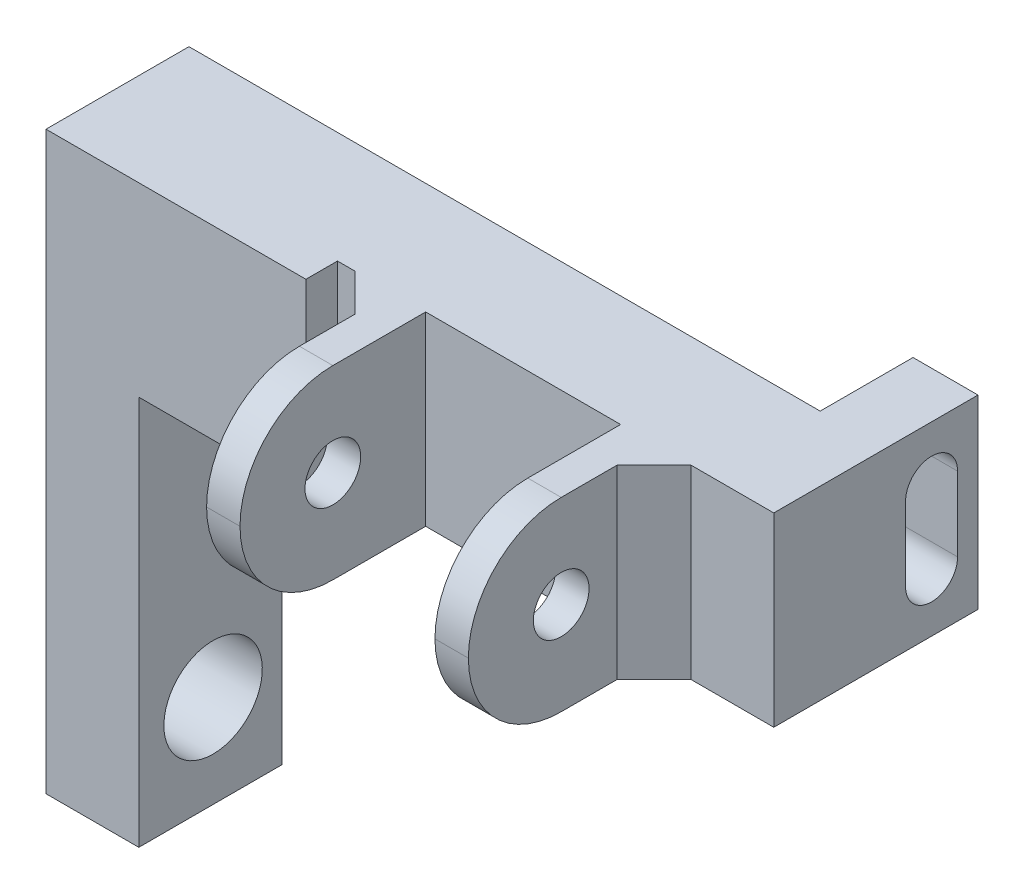
ISO-10303-21;
HEADER;
FILE_DESCRIPTION(('STEP AP214'),'2;1');
FILE_NAME('part.step','',(''),(''),'','','');
FILE_SCHEMA(('AUTOMOTIVE_DESIGN { 1 0 10303 214 1 1 1 1 }'));
ENDSEC;
DATA;
#1=APPLICATION_CONTEXT('core data for automotive mechanical design processes');
#2=APPLICATION_PROTOCOL_DEFINITION('international standard','automotive_design',2000,#1);
#3=PRODUCT_CONTEXT('',#1,'mechanical');
#4=PRODUCT('Part','Part','',(#3));
#5=PRODUCT_RELATED_PRODUCT_CATEGORY('part','',(#4));
#6=PRODUCT_DEFINITION_FORMATION('','',#4);
#7=PRODUCT_DEFINITION_CONTEXT('part definition',#1,'design');
#8=PRODUCT_DEFINITION('design','',#6,#7);
#9=PRODUCT_DEFINITION_SHAPE('','',#8);
#10=(LENGTH_UNIT() NAMED_UNIT(*) SI_UNIT(.MILLI.,.METRE.));
#11=(NAMED_UNIT(*) PLANE_ANGLE_UNIT() SI_UNIT($,.RADIAN.));
#12=(NAMED_UNIT(*) SI_UNIT($,.STERADIAN.) SOLID_ANGLE_UNIT());
#13=UNCERTAINTY_MEASURE_WITH_UNIT(LENGTH_MEASURE(1.E-05),#10,'distance_accuracy_value','');
#14=(GEOMETRIC_REPRESENTATION_CONTEXT(3) GLOBAL_UNCERTAINTY_ASSIGNED_CONTEXT((#13)) GLOBAL_UNIT_ASSIGNED_CONTEXT((#10,
#11,#12)) REPRESENTATION_CONTEXT('',''));
#15=CARTESIAN_POINT('',(0.,0.,0.));
#16=DIRECTION('',(0.,0.,1.));
#17=DIRECTION('',(1.,0.,0.));
#18=AXIS2_PLACEMENT_3D('',#15,#16,#17);
#19=CARTESIAN_POINT('',(0.,0.,6.));
#20=DIRECTION('',(0.,0.,1.));
#21=DIRECTION('',(1.,0.,0.));
#22=AXIS2_PLACEMENT_3D('',#19,#20,#21);
#23=PLANE('',#22);
#24=DIRECTION('',(1.,0.,0.));
#25=VECTOR('',#24,1.);
#26=CARTESIAN_POINT('',(-10.,5.,6.));
#27=LINE('',#26,#25);
#28=CARTESIAN_POINT('',(-5.25,5.,6.));
#29=VERTEX_POINT('',#28);
#30=CARTESIAN_POINT('',(5.25,5.,6.));
#31=VERTEX_POINT('',#30);
#32=EDGE_CURVE('E361',#29,#31,#27,.T.);
#33=ORIENTED_EDGE('',*,*,#32,.T.);
#34=DIRECTION('',(0.,-1.,0.));
#35=VECTOR('',#34,1.);
#36=CARTESIAN_POINT('',(5.25,15.,6.));
#37=LINE('',#36,#35);
#38=CARTESIAN_POINT('',(5.25,15.,6.));
#39=VERTEX_POINT('',#38);
#40=EDGE_CURVE('E340',#39,#31,#37,.T.);
#41=ORIENTED_EDGE('',*,*,#40,.F.);
#42=DIRECTION('',(-1.,0.,0.));
#43=VECTOR('',#42,1.);
#44=CARTESIAN_POINT('',(-10.,15.,6.));
#45=LINE('',#44,#43);
#46=CARTESIAN_POINT('',(-5.25,15.,6.));
#47=VERTEX_POINT('',#46);
#48=EDGE_CURVE('E366',#39,#47,#45,.T.);
#49=ORIENTED_EDGE('',*,*,#48,.T.);
#50=DIRECTION('',(0.,1.,0.));
#51=VECTOR('',#50,1.);
#52=CARTESIAN_POINT('',(-5.25,15.,6.));
#53=LINE('',#52,#51);
#54=EDGE_CURVE('E343',#29,#47,#53,.T.);
#55=ORIENTED_EDGE('',*,*,#54,.F.);
#56=EDGE_LOOP('',(#33,#41,#49,#55));
#57=FACE_BOUND('',#56,.T.);
#58=ADVANCED_FACE('F45',(#57),#23,.T.);
#59=CARTESIAN_POINT('',(13.5,15.,6.));
#60=VERTEX_POINT('',#59);
#61=CARTESIAN_POINT('',(9.05,15.,6.));
#62=VERTEX_POINT('',#61);
#63=EDGE_CURVE('E362',#60,#62,#45,.T.);
#64=ORIENTED_EDGE('',*,*,#63,.T.);
#65=DIRECTION('',(0.,-1.,0.));
#66=VECTOR('',#65,1.);
#67=CARTESIAN_POINT('',(9.05,0.,6.));
#68=LINE('',#67,#66);
#69=CARTESIAN_POINT('',(9.05,5.,6.));
#70=VERTEX_POINT('',#69);
#71=EDGE_CURVE('E404',#62,#70,#68,.T.);
#72=ORIENTED_EDGE('',*,*,#71,.T.);
#73=CARTESIAN_POINT('',(13.5,5.,6.));
#74=VERTEX_POINT('',#73);
#75=EDGE_CURVE('E358',#70,#74,#27,.T.);
#76=ORIENTED_EDGE('',*,*,#75,.T.);
#77=DIRECTION('',(0.,-1.,0.));
#78=VECTOR('',#77,1.);
#79=CARTESIAN_POINT('',(13.5,15.,6.));
#80=LINE('',#79,#78);
#81=EDGE_CURVE('E292',#60,#74,#80,.T.);
#82=ORIENTED_EDGE('',*,*,#81,.F.);
#83=EDGE_LOOP('',(#64,#72,#76,#82));
#84=FACE_BOUND('',#83,.T.);
#85=ADVANCED_FACE('F454',(#84),#23,.T.);
#86=CARTESIAN_POINT('',(-10.,5.,6.));
#87=VERTEX_POINT('',#86);
#88=CARTESIAN_POINT('',(-9.04999999999999,5.,6.));
#89=VERTEX_POINT('',#88);
#90=EDGE_CURVE('E226',#87,#89,#27,.T.);
#91=ORIENTED_EDGE('',*,*,#90,.T.);
#92=DIRECTION('',(0.,1.,0.));
#93=VECTOR('',#92,1.);
#94=CARTESIAN_POINT('',(-9.04999999999999,0.,6.));
#95=LINE('',#94,#93);
#96=CARTESIAN_POINT('',(-9.04999999999999,15.,6.));
#97=VERTEX_POINT('',#96);
#98=EDGE_CURVE('E409',#89,#97,#95,.T.);
#99=ORIENTED_EDGE('',*,*,#98,.T.);
#100=CARTESIAN_POINT('',(-10.,15.,6.));
#101=VERTEX_POINT('',#100);
#102=EDGE_CURVE('E360',#97,#101,#45,.T.);
#103=ORIENTED_EDGE('',*,*,#102,.T.);
#104=DIRECTION('',(0.,-1.,0.));
#105=VECTOR('',#104,1.);
#106=CARTESIAN_POINT('',(-10.,15.,6.));
#107=LINE('',#106,#105);
#108=EDGE_CURVE('E356',#101,#87,#107,.T.);
#109=ORIENTED_EDGE('',*,*,#108,.T.);
#110=EDGE_LOOP('',(#91,#99,#103,#109));
#111=FACE_BOUND('',#110,.T.);
#112=ADVANCED_FACE('F420',(#111),#23,.T.);
#113=CARTESIAN_POINT('',(0.,0.,0.));
#114=DIRECTION('',(0.,0.,1.));
#115=DIRECTION('',(1.,0.,0.));
#116=AXIS2_PLACEMENT_3D('',#113,#114,#115);
#117=PLANE('',#116);
#118=DIRECTION('',(-1.,0.,0.));
#119=VECTOR('',#118,1.);
#120=CARTESIAN_POINT('',(0.,5.,0.));
#121=LINE('',#120,#119);
#122=CARTESIAN_POINT('',(10.,5.,0.));
#123=VERTEX_POINT('',#122);
#124=CARTESIAN_POINT('',(-19.,5.,0.));
#125=VERTEX_POINT('',#124);
#126=EDGE_CURVE('E314',#123,#125,#121,.T.);
#127=ORIENTED_EDGE('',*,*,#126,.T.);
#128=DIRECTION('',(0.,-1.,0.));
#129=VECTOR('',#128,1.);
#130=CARTESIAN_POINT('',(-19.,0.,0.));
#131=LINE('',#130,#129);
#132=CARTESIAN_POINT('',(-19.,-16.,0.));
#133=VERTEX_POINT('',#132);
#134=EDGE_CURVE('E248',#125,#133,#131,.T.);
#135=ORIENTED_EDGE('',*,*,#134,.T.);
#136=DIRECTION('',(1.,0.,0.));
#137=VECTOR('',#136,1.);
#138=CARTESIAN_POINT('',(-24.,-16.,0.));
#139=LINE('',#138,#137);
#140=CARTESIAN_POINT('',(-24.,-16.,0.));
#141=VERTEX_POINT('',#140);
#142=EDGE_CURVE('E256',#141,#133,#139,.T.);
#143=ORIENTED_EDGE('',*,*,#142,.F.);
#144=DIRECTION('',(0.,-1.,0.));
#145=VECTOR('',#144,1.);
#146=CARTESIAN_POINT('',(-24.,15.,0.));
#147=LINE('',#146,#145);
#148=CARTESIAN_POINT('',(-24.,15.,0.));
#149=VERTEX_POINT('',#148);
#150=EDGE_CURVE('E593',#149,#141,#147,.T.);
#151=ORIENTED_EDGE('',*,*,#150,.F.);
#152=DIRECTION('',(-1.,0.,0.));
#153=VECTOR('',#152,1.);
#154=CARTESIAN_POINT('',(10.,15.,0.));
#155=LINE('',#154,#153);
#156=CARTESIAN_POINT('',(10.,15.,0.));
#157=VERTEX_POINT('',#156);
#158=EDGE_CURVE('E369',#157,#149,#155,.T.);
#159=ORIENTED_EDGE('',*,*,#158,.F.);
#160=DIRECTION('',(0.,1.,0.));
#161=VECTOR('',#160,1.);
#162=CARTESIAN_POINT('',(10.,-15.,0.));
#163=LINE('',#162,#161);
#164=EDGE_CURVE('E365',#123,#157,#163,.T.);
#165=ORIENTED_EDGE('',*,*,#164,.F.);
#166=EDGE_LOOP('',(#127,#135,#143,#151,#159,#165));
#167=FACE_BOUND('',#166,.T.);
#168=ADVANCED_FACE('F502',(#167),#117,.F.);
#169=CARTESIAN_POINT('',(10.,15.,3.));
#170=DIRECTION('',(0.,-1.,0.));
#171=DIRECTION('',(1.,0.,0.));
#172=AXIS2_PLACEMENT_3D('',#169,#170,#171);
#173=PLANE('',#172);
#174=DIRECTION('',(0.,0.,-1.));
#175=VECTOR('',#174,1.);
#176=CARTESIAN_POINT('',(5.25,15.,16.));
#177=LINE('',#176,#175);
#178=CARTESIAN_POINT('',(5.25,15.,11.));
#179=VERTEX_POINT('',#178);
#180=EDGE_CURVE('E338',#179,#39,#177,.T.);
#181=ORIENTED_EDGE('',*,*,#180,.F.);
#182=DIRECTION('',(-1.,0.,0.));
#183=VECTOR('',#182,1.);
#184=CARTESIAN_POINT('',(7.05,15.,11.));
#185=LINE('',#184,#183);
#186=CARTESIAN_POINT('',(7.05,15.,11.));
#187=VERTEX_POINT('',#186);
#188=EDGE_CURVE('E395',#179,#187,#185,.F.);
#189=ORIENTED_EDGE('',*,*,#188,.T.);
#190=DIRECTION('',(0.,0.,-1.));
#191=VECTOR('',#190,1.);
#192=CARTESIAN_POINT('',(7.05,15.,16.));
#193=LINE('',#192,#191);
#194=CARTESIAN_POINT('',(7.05,15.,8.00000000000002));
#195=VERTEX_POINT('',#194);
#196=EDGE_CURVE('E335',#187,#195,#193,.T.);
#197=ORIENTED_EDGE('',*,*,#196,.T.);
#198=DIRECTION('',(0.707106781186544,0.,-0.707106781186551));
#199=VECTOR('',#198,1.);
#200=CARTESIAN_POINT('',(11.025,15.,4.02499999999998));
#201=LINE('',#200,#199);
#202=EDGE_CURVE('E411',#195,#62,#201,.T.);
#203=ORIENTED_EDGE('',*,*,#202,.T.);
#204=ORIENTED_EDGE('',*,*,#63,.F.);
#205=DIRECTION('',(0.,0.,1.));
#206=VECTOR('',#205,1.);
#207=CARTESIAN_POINT('',(13.5,15.,6.));
#208=LINE('',#207,#206);
#209=CARTESIAN_POINT('',(13.5,15.,-5.));
#210=VERTEX_POINT('',#209);
#211=EDGE_CURVE('E300',#210,#60,#208,.T.);
#212=ORIENTED_EDGE('',*,*,#211,.F.);
#213=DIRECTION('',(-1.,0.,0.));
#214=VECTOR('',#213,1.);
#215=CARTESIAN_POINT('',(13.5,15.,-5.));
#216=LINE('',#215,#214);
#217=CARTESIAN_POINT('',(10.,15.,-5.));
#218=VERTEX_POINT('',#217);
#219=EDGE_CURVE('E303',#210,#218,#216,.T.);
#220=ORIENTED_EDGE('',*,*,#219,.T.);
#221=DIRECTION('',(0.,0.,1.));
#222=VECTOR('',#221,1.);
#223=CARTESIAN_POINT('',(10.,15.,6.));
#224=LINE('',#223,#222);
#225=EDGE_CURVE('E296',#218,#157,#224,.T.);
#226=ORIENTED_EDGE('',*,*,#225,.T.);
#227=ORIENTED_EDGE('',*,*,#158,.T.);
#228=DIRECTION('',(0.,0.,-1.));
#229=VECTOR('',#228,1.);
#230=CARTESIAN_POINT('',(-24.,15.,7.7));
#231=LINE('',#230,#229);
#232=CARTESIAN_POINT('',(-24.,15.,7.7));
#233=VERTEX_POINT('',#232);
#234=EDGE_CURVE('E591',#233,#149,#231,.T.);
#235=ORIENTED_EDGE('',*,*,#234,.F.);
#236=DIRECTION('',(1.,0.,0.));
#237=VECTOR('',#236,1.);
#238=CARTESIAN_POINT('',(-24.,15.,7.7));
#239=LINE('',#238,#237);
#240=CARTESIAN_POINT('',(-10.,15.,7.7));
#241=VERTEX_POINT('',#240);
#242=EDGE_CURVE('E259',#233,#241,#239,.T.);
#243=ORIENTED_EDGE('',*,*,#242,.T.);
#244=DIRECTION('',(0.,0.,-1.));
#245=VECTOR('',#244,1.);
#246=CARTESIAN_POINT('',(-10.,15.,7.7));
#247=LINE('',#246,#245);
#248=EDGE_CURVE('E241',#241,#101,#247,.T.);
#249=ORIENTED_EDGE('',*,*,#248,.T.);
#250=ORIENTED_EDGE('',*,*,#102,.F.);
#251=DIRECTION('',(0.707106781186543,0.,0.707106781186552));
#252=VECTOR('',#251,1.);
#253=CARTESIAN_POINT('',(-1.02500000000011,15.,14.025));
#254=LINE('',#253,#252);
#255=CARTESIAN_POINT('',(-7.05,15.,8.00000000000002));
#256=VERTEX_POINT('',#255);
#257=EDGE_CURVE('E11',#97,#256,#254,.T.);
#258=ORIENTED_EDGE('',*,*,#257,.T.);
#259=DIRECTION('',(0.,0.,-1.));
#260=VECTOR('',#259,1.);
#261=CARTESIAN_POINT('',(-7.05,15.,16.));
#262=LINE('',#261,#260);
#263=CARTESIAN_POINT('',(-7.05,15.,11.));
#264=VERTEX_POINT('',#263);
#265=EDGE_CURVE('E346',#264,#256,#262,.T.);
#266=ORIENTED_EDGE('',*,*,#265,.F.);
#267=DIRECTION('',(-1.,0.,0.));
#268=VECTOR('',#267,1.);
#269=CARTESIAN_POINT('',(-5.25,15.,11.));
#270=LINE('',#269,#268);
#271=CARTESIAN_POINT('',(-5.25,15.,11.));
#272=VERTEX_POINT('',#271);
#273=EDGE_CURVE('E393',#264,#272,#270,.F.);
#274=ORIENTED_EDGE('',*,*,#273,.T.);
#275=DIRECTION('',(0.,0.,-1.));
#276=VECTOR('',#275,1.);
#277=CARTESIAN_POINT('',(-5.25,15.,16.));
#278=LINE('',#277,#276);
#279=EDGE_CURVE('E349',#272,#47,#278,.T.);
#280=ORIENTED_EDGE('',*,*,#279,.T.);
#281=ORIENTED_EDGE('',*,*,#48,.F.);
#282=EDGE_LOOP('',(#181,#189,#197,#203,#204,#212,#220,#226,#227,#235,#243,#249,#250,#258,#266,
#274,#280,#281));
#283=FACE_BOUND('',#282,.T.);
#284=ADVANCED_FACE('F427',(#283),#173,.F.);
#285=CARTESIAN_POINT('',(-10.,5.,6.));
#286=DIRECTION('',(0.,1.,0.));
#287=DIRECTION('',(-1.,0.,0.));
#288=AXIS2_PLACEMENT_3D('',#285,#286,#287);
#289=PLANE('',#288);
#290=DIRECTION('',(0.,0.,-1.));
#291=VECTOR('',#290,1.);
#292=CARTESIAN_POINT('',(7.05,5.,16.));
#293=LINE('',#292,#291);
#294=CARTESIAN_POINT('',(7.05,5.,11.));
#295=VERTEX_POINT('',#294);
#296=CARTESIAN_POINT('',(7.05,5.,8.00000000000002));
#297=VERTEX_POINT('',#296);
#298=EDGE_CURVE('E331',#295,#297,#293,.T.);
#299=ORIENTED_EDGE('',*,*,#298,.F.);
#300=DIRECTION('',(1.,0.,0.));
#301=VECTOR('',#300,1.);
#302=CARTESIAN_POINT('',(5.25,5.,11.));
#303=LINE('',#302,#301);
#304=CARTESIAN_POINT('',(5.25,5.,11.));
#305=VERTEX_POINT('',#304);
#306=EDGE_CURVE('E378',#295,#305,#303,.F.);
#307=ORIENTED_EDGE('',*,*,#306,.T.);
#308=DIRECTION('',(0.,0.,-1.));
#309=VECTOR('',#308,1.);
#310=CARTESIAN_POINT('',(5.25,5.,16.));
#311=LINE('',#310,#309);
#312=EDGE_CURVE('E329',#305,#31,#311,.T.);
#313=ORIENTED_EDGE('',*,*,#312,.T.);
#314=ORIENTED_EDGE('',*,*,#32,.F.);
#315=DIRECTION('',(0.,0.,-1.));
#316=VECTOR('',#315,1.);
#317=CARTESIAN_POINT('',(-5.25,5.,16.));
#318=LINE('',#317,#316);
#319=CARTESIAN_POINT('',(-5.25,5.,11.));
#320=VERTEX_POINT('',#319);
#321=EDGE_CURVE('E351',#320,#29,#318,.T.);
#322=ORIENTED_EDGE('',*,*,#321,.F.);
#323=DIRECTION('',(1.,0.,0.));
#324=VECTOR('',#323,1.);
#325=CARTESIAN_POINT('',(-7.05,5.,11.));
#326=LINE('',#325,#324);
#327=CARTESIAN_POINT('',(-7.05,5.,11.));
#328=VERTEX_POINT('',#327);
#329=EDGE_CURVE('E375',#320,#328,#326,.F.);
#330=ORIENTED_EDGE('',*,*,#329,.T.);
#331=DIRECTION('',(0.,0.,-1.));
#332=VECTOR('',#331,1.);
#333=CARTESIAN_POINT('',(-7.05,5.,16.));
#334=LINE('',#333,#332);
#335=CARTESIAN_POINT('',(-7.05,5.,8.00000000000002));
#336=VERTEX_POINT('',#335);
#337=EDGE_CURVE('E353',#328,#336,#334,.T.);
#338=ORIENTED_EDGE('',*,*,#337,.T.);
#339=DIRECTION('',(-0.707106781186543,0.,-0.707106781186552));
#340=VECTOR('',#339,1.);
#341=CARTESIAN_POINT('',(-9.52499999999999,5.,5.525));
#342=LINE('',#341,#340);
#343=EDGE_CURVE('E55',#336,#89,#342,.T.);
#344=ORIENTED_EDGE('',*,*,#343,.T.);
#345=ORIENTED_EDGE('',*,*,#90,.F.);
#346=DIRECTION('',(0.,0.,1.));
#347=VECTOR('',#346,1.);
#348=CARTESIAN_POINT('',(-10.,5.,-2.3));
#349=LINE('',#348,#347);
#350=CARTESIAN_POINT('',(-10.,5.,7.7));
#351=VERTEX_POINT('',#350);
#352=EDGE_CURVE('E219',#87,#351,#349,.T.);
#353=ORIENTED_EDGE('',*,*,#352,.T.);
#354=DIRECTION('',(-1.,0.,0.));
#355=VECTOR('',#354,1.);
#356=CARTESIAN_POINT('',(-10.,5.,7.7));
#357=LINE('',#356,#355);
#358=CARTESIAN_POINT('',(-19.,5.,7.7));
#359=VERTEX_POINT('',#358);
#360=EDGE_CURVE('E224',#351,#359,#357,.T.);
#361=ORIENTED_EDGE('',*,*,#360,.T.);
#362=DIRECTION('',(0.,0.,1.));
#363=VECTOR('',#362,1.);
#364=CARTESIAN_POINT('',(-19.,5.,-2.3));
#365=LINE('',#364,#363);
#366=EDGE_CURVE('E230',#125,#359,#365,.T.);
#367=ORIENTED_EDGE('',*,*,#366,.F.);
#368=ORIENTED_EDGE('',*,*,#126,.F.);
#369=DIRECTION('',(0.,0.,-1.));
#370=VECTOR('',#369,1.);
#371=CARTESIAN_POINT('',(10.,5.,6.));
#372=LINE('',#371,#370);
#373=CARTESIAN_POINT('',(10.,5.,-5.));
#374=VERTEX_POINT('',#373);
#375=EDGE_CURVE('E285',#123,#374,#372,.T.);
#376=ORIENTED_EDGE('',*,*,#375,.T.);
#377=DIRECTION('',(-1.,0.,0.));
#378=VECTOR('',#377,1.);
#379=CARTESIAN_POINT('',(13.5,5.,-5.));
#380=LINE('',#379,#378);
#381=CARTESIAN_POINT('',(13.5,5.,-5.));
#382=VERTEX_POINT('',#381);
#383=EDGE_CURVE('E311',#382,#374,#380,.T.);
#384=ORIENTED_EDGE('',*,*,#383,.F.);
#385=DIRECTION('',(0.,0.,-1.));
#386=VECTOR('',#385,1.);
#387=CARTESIAN_POINT('',(13.5,5.,6.));
#388=LINE('',#387,#386);
#389=EDGE_CURVE('E295',#74,#382,#388,.T.);
#390=ORIENTED_EDGE('',*,*,#389,.F.);
#391=ORIENTED_EDGE('',*,*,#75,.F.);
#392=DIRECTION('',(-0.707106781186544,0.,0.707106781186551));
#393=VECTOR('',#392,1.);
#394=CARTESIAN_POINT('',(-0.474999999999899,5.,15.525));
#395=LINE('',#394,#393);
#396=EDGE_CURVE('E413',#70,#297,#395,.T.);
#397=ORIENTED_EDGE('',*,*,#396,.T.);
#398=EDGE_LOOP('',(#299,#307,#313,#314,#322,#330,#338,#344,#345,#353,#361,#367,#368,#376,#384,
#390,#391,#397));
#399=FACE_BOUND('',#398,.T.);
#400=ADVANCED_FACE('F222',(#399),#289,.F.);
#401=CARTESIAN_POINT('',(-7.05,15.,16.));
#402=DIRECTION('',(1.,0.,0.));
#403=DIRECTION('',(0.,0.,-1.));
#404=AXIS2_PLACEMENT_3D('',#401,#402,#403);
#405=PLANE('',#404);
#406=CARTESIAN_POINT('',(-7.05,10.,11.));
#407=DIRECTION('',(-1.,0.,0.));
#408=DIRECTION('',(0.,0.,1.));
#409=AXIS2_PLACEMENT_3D('',#406,#407,#408);
#410=CIRCLE('',#409,1.5);
#411=CARTESIAN_POINT('',(-7.05,10.,12.5));
#412=VERTEX_POINT('',#411);
#413=EDGE_CURVE('E316',#412,#412,#410,.T.);
#414=ORIENTED_EDGE('',*,*,#413,.F.);
#415=EDGE_LOOP('',(#414));
#416=FACE_BOUND('',#415,.T.);
#417=ORIENTED_EDGE('',*,*,#265,.T.);
#418=DIRECTION('',(0.,-1.,0.));
#419=VECTOR('',#418,1.);
#420=CARTESIAN_POINT('',(-7.05,15.,8.00000000000002));
#421=LINE('',#420,#419);
#422=EDGE_CURVE('E406',#256,#336,#421,.T.);
#423=ORIENTED_EDGE('',*,*,#422,.T.);
#424=ORIENTED_EDGE('',*,*,#337,.F.);
#425=CARTESIAN_POINT('',(-7.05,10.,11.));
#426=DIRECTION('',(1.,0.,0.));
#427=DIRECTION('',(0.,0.,-1.));
#428=AXIS2_PLACEMENT_3D('',#425,#426,#427);
#429=CIRCLE('',#428,5.);
#430=CARTESIAN_POINT('',(-7.05,10.,16.));
#431=VERTEX_POINT('',#430);
#432=EDGE_CURVE('E391',#328,#431,#429,.F.);
#433=ORIENTED_EDGE('',*,*,#432,.T.);
#434=CARTESIAN_POINT('',(-7.05,10.,11.));
#435=DIRECTION('',(1.,0.,0.));
#436=DIRECTION('',(0.,0.,-1.));
#437=AXIS2_PLACEMENT_3D('',#434,#435,#436);
#438=CIRCLE('',#437,5.);
#439=EDGE_CURVE('E389',#431,#264,#438,.F.);
#440=ORIENTED_EDGE('',*,*,#439,.T.);
#441=EDGE_LOOP('',(#417,#423,#424,#433,#440));
#442=FACE_BOUND('',#441,.T.);
#443=ADVANCED_FACE('F430',(#416,#442),#405,.F.);
#444=CARTESIAN_POINT('',(-5.25,15.,16.));
#445=DIRECTION('',(-1.,0.,0.));
#446=DIRECTION('',(0.,-1.,0.));
#447=AXIS2_PLACEMENT_3D('',#444,#445,#446);
#448=PLANE('',#447);
#449=CARTESIAN_POINT('',(-5.25,10.,11.));
#450=DIRECTION('',(-1.,0.,0.));
#451=DIRECTION('',(0.,-1.,0.));
#452=AXIS2_PLACEMENT_3D('',#449,#450,#451);
#453=CIRCLE('',#452,1.5);
#454=CARTESIAN_POINT('',(-5.25,8.5,11.));
#455=VERTEX_POINT('',#454);
#456=EDGE_CURVE('E325',#455,#455,#453,.T.);
#457=ORIENTED_EDGE('',*,*,#456,.T.);
#458=EDGE_LOOP('',(#457));
#459=FACE_BOUND('',#458,.T.);
#460=CARTESIAN_POINT('',(-5.25,10.,11.));
#461=DIRECTION('',(-1.,0.,0.));
#462=DIRECTION('',(0.,-1.,0.));
#463=AXIS2_PLACEMENT_3D('',#460,#461,#462);
#464=CIRCLE('',#463,5.);
#465=CARTESIAN_POINT('',(-5.25,10.,16.));
#466=VERTEX_POINT('',#465);
#467=EDGE_CURVE('E385',#272,#466,#464,.F.);
#468=ORIENTED_EDGE('',*,*,#467,.T.);
#469=CARTESIAN_POINT('',(-5.25,10.,11.));
#470=DIRECTION('',(-1.,0.,0.));
#471=DIRECTION('',(0.,-1.,0.));
#472=AXIS2_PLACEMENT_3D('',#469,#470,#471);
#473=CIRCLE('',#472,5.);
#474=EDGE_CURVE('E387',#466,#320,#473,.F.);
#475=ORIENTED_EDGE('',*,*,#474,.T.);
#476=ORIENTED_EDGE('',*,*,#321,.T.);
#477=ORIENTED_EDGE('',*,*,#54,.T.);
#478=ORIENTED_EDGE('',*,*,#279,.F.);
#479=EDGE_LOOP('',(#468,#475,#476,#477,#478));
#480=FACE_BOUND('',#479,.T.);
#481=ADVANCED_FACE('F442',(#459,#480),#448,.F.);
#482=CARTESIAN_POINT('',(5.25,15.,16.));
#483=DIRECTION('',(1.,0.,0.));
#484=DIRECTION('',(0.,1.,0.));
#485=AXIS2_PLACEMENT_3D('',#482,#483,#484);
#486=PLANE('',#485);
#487=CARTESIAN_POINT('',(5.25,10.,11.));
#488=DIRECTION('',(1.,0.,0.));
#489=DIRECTION('',(0.,1.,0.));
#490=AXIS2_PLACEMENT_3D('',#487,#488,#489);
#491=CIRCLE('',#490,1.5);
#492=CARTESIAN_POINT('',(5.25,11.5,11.));
#493=VERTEX_POINT('',#492);
#494=EDGE_CURVE('E322',#493,#493,#491,.T.);
#495=ORIENTED_EDGE('',*,*,#494,.T.);
#496=EDGE_LOOP('',(#495));
#497=FACE_BOUND('',#496,.T.);
#498=ORIENTED_EDGE('',*,*,#312,.F.);
#499=CARTESIAN_POINT('',(5.25,10.,11.));
#500=DIRECTION('',(1.,0.,0.));
#501=DIRECTION('',(0.,1.,0.));
#502=AXIS2_PLACEMENT_3D('',#499,#500,#501);
#503=CIRCLE('',#502,5.);
#504=CARTESIAN_POINT('',(5.25,10.,16.));
#505=VERTEX_POINT('',#504);
#506=EDGE_CURVE('E383',#305,#505,#503,.F.);
#507=ORIENTED_EDGE('',*,*,#506,.T.);
#508=CARTESIAN_POINT('',(5.25,10.,11.));
#509=DIRECTION('',(1.,0.,0.));
#510=DIRECTION('',(0.,1.,0.));
#511=AXIS2_PLACEMENT_3D('',#508,#509,#510);
#512=CIRCLE('',#511,5.);
#513=EDGE_CURVE('E381',#505,#179,#512,.F.);
#514=ORIENTED_EDGE('',*,*,#513,.T.);
#515=ORIENTED_EDGE('',*,*,#180,.T.);
#516=ORIENTED_EDGE('',*,*,#40,.T.);
#517=EDGE_LOOP('',(#498,#507,#514,#515,#516));
#518=FACE_BOUND('',#517,.T.);
#519=ADVANCED_FACE('F477',(#497,#518),#486,.F.);
#520=CARTESIAN_POINT('',(7.05,15.,16.));
#521=DIRECTION('',(-1.,0.,0.));
#522=DIRECTION('',(0.,-1.,0.));
#523=AXIS2_PLACEMENT_3D('',#520,#521,#522);
#524=PLANE('',#523);
#525=CARTESIAN_POINT('',(7.05,10.,11.));
#526=DIRECTION('',(-1.,0.,0.));
#527=DIRECTION('',(0.,-1.,0.));
#528=AXIS2_PLACEMENT_3D('',#525,#526,#527);
#529=CIRCLE('',#528,1.5);
#530=CARTESIAN_POINT('',(7.05,8.5,11.));
#531=VERTEX_POINT('',#530);
#532=EDGE_CURVE('E319',#531,#531,#529,.F.);
#533=ORIENTED_EDGE('',*,*,#532,.F.);
#534=EDGE_LOOP('',(#533));
#535=FACE_BOUND('',#534,.T.);
#536=ORIENTED_EDGE('',*,*,#298,.T.);
#537=DIRECTION('',(0.,1.,0.));
#538=VECTOR('',#537,1.);
#539=CARTESIAN_POINT('',(7.05,15.,8.00000000000002));
#540=LINE('',#539,#538);
#541=EDGE_CURVE('E397',#297,#195,#540,.T.);
#542=ORIENTED_EDGE('',*,*,#541,.T.);
#543=ORIENTED_EDGE('',*,*,#196,.F.);
#544=CARTESIAN_POINT('',(7.05,10.,11.));
#545=DIRECTION('',(-1.,0.,0.));
#546=DIRECTION('',(0.,-1.,0.));
#547=AXIS2_PLACEMENT_3D('',#544,#545,#546);
#548=CIRCLE('',#547,5.);
#549=CARTESIAN_POINT('',(7.05,10.,16.));
#550=VERTEX_POINT('',#549);
#551=EDGE_CURVE('E371',#187,#550,#548,.F.);
#552=ORIENTED_EDGE('',*,*,#551,.T.);
#553=CARTESIAN_POINT('',(7.05,10.,11.));
#554=DIRECTION('',(-1.,0.,0.));
#555=DIRECTION('',(0.,-1.,0.));
#556=AXIS2_PLACEMENT_3D('',#553,#554,#555);
#557=CIRCLE('',#556,5.);
#558=EDGE_CURVE('E373',#550,#295,#557,.F.);
#559=ORIENTED_EDGE('',*,*,#558,.T.);
#560=EDGE_LOOP('',(#536,#542,#543,#552,#559));
#561=FACE_BOUND('',#560,.T.);
#562=ADVANCED_FACE('F469',(#535,#561),#524,.F.);
#563=CARTESIAN_POINT('',(0.,10.,11.));
#564=DIRECTION('',(1.,0.,0.));
#565=DIRECTION('',(0.,1.,0.));
#566=AXIS2_PLACEMENT_3D('',#563,#564,#565);
#567=CYLINDRICAL_SURFACE('',#566,5.);
#568=ORIENTED_EDGE('',*,*,#188,.F.);
#569=ORIENTED_EDGE('',*,*,#513,.F.);
#570=DIRECTION('',(-1.,0.,0.));
#571=VECTOR('',#570,1.);
#572=CARTESIAN_POINT('',(5.25,10.,16.));
#573=LINE('',#572,#571);
#574=EDGE_CURVE('E332',#550,#505,#573,.T.);
#575=ORIENTED_EDGE('',*,*,#574,.F.);
#576=ORIENTED_EDGE('',*,*,#551,.F.);
#577=EDGE_LOOP('',(#568,#569,#575,#576));
#578=FACE_BOUND('',#577,.T.);
#579=ADVANCED_FACE('F483',(#578),#567,.T.);
#580=CARTESIAN_POINT('',(0.,10.,11.));
#581=DIRECTION('',(-1.,0.,0.));
#582=DIRECTION('',(0.,-1.,0.));
#583=AXIS2_PLACEMENT_3D('',#580,#581,#582);
#584=CYLINDRICAL_SURFACE('',#583,5.);
#585=ORIENTED_EDGE('',*,*,#506,.F.);
#586=ORIENTED_EDGE('',*,*,#306,.F.);
#587=ORIENTED_EDGE('',*,*,#558,.F.);
#588=ORIENTED_EDGE('',*,*,#574,.T.);
#589=EDGE_LOOP('',(#585,#586,#587,#588));
#590=FACE_BOUND('',#589,.T.);
#591=ADVANCED_FACE('F475',(#590),#584,.T.);
#592=CARTESIAN_POINT('',(0.,10.,11.));
#593=DIRECTION('',(1.,0.,0.));
#594=DIRECTION('',(0.,1.,0.));
#595=AXIS2_PLACEMENT_3D('',#592,#593,#594);
#596=CYLINDRICAL_SURFACE('',#595,5.);
#597=ORIENTED_EDGE('',*,*,#273,.F.);
#598=ORIENTED_EDGE('',*,*,#439,.F.);
#599=DIRECTION('',(-1.,0.,0.));
#600=VECTOR('',#599,1.);
#601=CARTESIAN_POINT('',(-7.05,10.,16.));
#602=LINE('',#601,#600);
#603=EDGE_CURVE('E328',#466,#431,#602,.T.);
#604=ORIENTED_EDGE('',*,*,#603,.F.);
#605=ORIENTED_EDGE('',*,*,#467,.F.);
#606=EDGE_LOOP('',(#597,#598,#604,#605));
#607=FACE_BOUND('',#606,.T.);
#608=ADVANCED_FACE('F434',(#607),#596,.T.);
#609=CARTESIAN_POINT('',(0.,10.,11.));
#610=DIRECTION('',(-1.,0.,0.));
#611=DIRECTION('',(0.,-1.,0.));
#612=AXIS2_PLACEMENT_3D('',#609,#610,#611);
#613=CYLINDRICAL_SURFACE('',#612,5.);
#614=ORIENTED_EDGE('',*,*,#432,.F.);
#615=ORIENTED_EDGE('',*,*,#329,.F.);
#616=ORIENTED_EDGE('',*,*,#474,.F.);
#617=ORIENTED_EDGE('',*,*,#603,.T.);
#618=EDGE_LOOP('',(#614,#615,#616,#617));
#619=FACE_BOUND('',#618,.T.);
#620=ADVANCED_FACE('F438',(#619),#613,.T.);
#621=CARTESIAN_POINT('',(11.2926406871193,10.,11.));
#622=DIRECTION('',(-1.,0.,0.));
#623=DIRECTION('',(0.,0.,1.));
#624=AXIS2_PLACEMENT_3D('',#621,#622,#623);
#625=CYLINDRICAL_SURFACE('',#624,1.5);
#626=ORIENTED_EDGE('',*,*,#532,.T.);
#627=EDGE_LOOP('',(#626));
#628=FACE_BOUND('',#627,.T.);
#629=ORIENTED_EDGE('',*,*,#494,.F.);
#630=EDGE_LOOP('',(#629));
#631=FACE_BOUND('',#630,.T.);
#632=ADVANCED_FACE('F532',(#628,#631),#625,.F.);
#633=ORIENTED_EDGE('',*,*,#413,.T.);
#634=EDGE_LOOP('',(#633));
#635=FACE_BOUND('',#634,.T.);
#636=ORIENTED_EDGE('',*,*,#456,.F.);
#637=EDGE_LOOP('',(#636));
#638=FACE_BOUND('',#637,.T.);
#639=ADVANCED_FACE('F530',(#635,#638),#625,.F.);
#640=CARTESIAN_POINT('',(7.05,15.,8.00000000000002));
#641=DIRECTION('',(-0.707106781186551,0.,-0.707106781186544));
#642=DIRECTION('',(0.,1.,0.));
#643=AXIS2_PLACEMENT_3D('',#640,#641,#642);
#644=PLANE('',#643);
#645=ORIENTED_EDGE('',*,*,#396,.F.);
#646=ORIENTED_EDGE('',*,*,#71,.F.);
#647=ORIENTED_EDGE('',*,*,#202,.F.);
#648=ORIENTED_EDGE('',*,*,#541,.F.);
#649=EDGE_LOOP('',(#645,#646,#647,#648));
#650=FACE_BOUND('',#649,.T.);
#651=ADVANCED_FACE('F465',(#650),#644,.F.);
#652=CARTESIAN_POINT('',(-7.05,15.,8.00000000000002));
#653=DIRECTION('',(0.707106781186552,0.,-0.707106781186543));
#654=DIRECTION('',(0.,-1.,0.));
#655=AXIS2_PLACEMENT_3D('',#652,#653,#654);
#656=PLANE('',#655);
#657=ORIENTED_EDGE('',*,*,#257,.F.);
#658=ORIENTED_EDGE('',*,*,#98,.F.);
#659=ORIENTED_EDGE('',*,*,#343,.F.);
#660=ORIENTED_EDGE('',*,*,#422,.F.);
#661=EDGE_LOOP('',(#657,#658,#659,#660));
#662=FACE_BOUND('',#661,.T.);
#663=ADVANCED_FACE('F48',(#662),#656,.F.);
#664=CARTESIAN_POINT('',(10.,0.,0.));
#665=DIRECTION('',(1.,0.,0.));
#666=DIRECTION('',(0.,0.,-1.));
#667=AXIS2_PLACEMENT_3D('',#664,#665,#666);
#668=PLANE('',#667);
#669=DIRECTION('',(0.,-1.,0.));
#670=VECTOR('',#669,1.);
#671=CARTESIAN_POINT('',(10.,8.,-1.1));
#672=LINE('',#671,#670);
#673=CARTESIAN_POINT('',(10.,12.,-1.1));
#674=VERTEX_POINT('',#673);
#675=CARTESIAN_POINT('',(10.,8.,-1.1));
#676=VERTEX_POINT('',#675);
#677=EDGE_CURVE('E270',#674,#676,#672,.T.);
#678=ORIENTED_EDGE('',*,*,#677,.T.);
#679=CARTESIAN_POINT('',(10.,8.,-2.5));
#680=DIRECTION('',(1.,0.,0.));
#681=DIRECTION('',(0.,0.,-1.));
#682=AXIS2_PLACEMENT_3D('',#679,#680,#681);
#683=CIRCLE('',#682,1.4);
#684=CARTESIAN_POINT('',(10.,8.,-3.9));
#685=VERTEX_POINT('',#684);
#686=EDGE_CURVE('E262',#676,#685,#683,.T.);
#687=ORIENTED_EDGE('',*,*,#686,.T.);
#688=DIRECTION('',(0.,1.,0.));
#689=VECTOR('',#688,1.);
#690=CARTESIAN_POINT('',(10.,8.,-3.9));
#691=LINE('',#690,#689);
#692=CARTESIAN_POINT('',(10.,12.,-3.9));
#693=VERTEX_POINT('',#692);
#694=EDGE_CURVE('E265',#685,#693,#691,.T.);
#695=ORIENTED_EDGE('',*,*,#694,.T.);
#696=CARTESIAN_POINT('',(10.,12.,-2.5));
#697=DIRECTION('',(1.,0.,0.));
#698=DIRECTION('',(0.,0.,-1.));
#699=AXIS2_PLACEMENT_3D('',#696,#697,#698);
#700=CIRCLE('',#699,1.4);
#701=EDGE_CURVE('E70',#693,#674,#700,.T.);
#702=ORIENTED_EDGE('',*,*,#701,.T.);
#703=EDGE_LOOP('',(#678,#687,#695,#702));
#704=FACE_BOUND('',#703,.T.);
#705=ORIENTED_EDGE('',*,*,#375,.F.);
#706=ORIENTED_EDGE('',*,*,#164,.T.);
#707=ORIENTED_EDGE('',*,*,#225,.F.);
#708=DIRECTION('',(0.,1.,0.));
#709=VECTOR('',#708,1.);
#710=CARTESIAN_POINT('',(10.,15.,-5.));
#711=LINE('',#710,#709);
#712=EDGE_CURVE('E305',#374,#218,#711,.T.);
#713=ORIENTED_EDGE('',*,*,#712,.F.);
#714=EDGE_LOOP('',(#705,#706,#707,#713));
#715=FACE_BOUND('',#714,.T.);
#716=ADVANCED_FACE('F537',(#704,#715),#668,.F.);
#717=CARTESIAN_POINT('',(13.5,15.,-5.));
#718=DIRECTION('',(0.,0.,1.));
#719=DIRECTION('',(0.,-1.,0.));
#720=AXIS2_PLACEMENT_3D('',#717,#718,#719);
#721=PLANE('',#720);
#722=ORIENTED_EDGE('',*,*,#712,.T.);
#723=ORIENTED_EDGE('',*,*,#219,.F.);
#724=DIRECTION('',(0.,1.,0.));
#725=VECTOR('',#724,1.);
#726=CARTESIAN_POINT('',(13.5,15.,-5.));
#727=LINE('',#726,#725);
#728=EDGE_CURVE('E298',#382,#210,#727,.T.);
#729=ORIENTED_EDGE('',*,*,#728,.F.);
#730=ORIENTED_EDGE('',*,*,#383,.T.);
#731=EDGE_LOOP('',(#722,#723,#729,#730));
#732=FACE_BOUND('',#731,.T.);
#733=ADVANCED_FACE('F534',(#732),#721,.F.);
#734=CARTESIAN_POINT('',(13.5,0.,0.));
#735=DIRECTION('',(1.,0.,0.));
#736=DIRECTION('',(0.,0.,-1.));
#737=AXIS2_PLACEMENT_3D('',#734,#735,#736);
#738=PLANE('',#737);
#739=CARTESIAN_POINT('',(13.5,8.,-2.5));
#740=DIRECTION('',(1.,0.,0.));
#741=DIRECTION('',(0.,0.,-1.));
#742=AXIS2_PLACEMENT_3D('',#739,#740,#741);
#743=CIRCLE('',#742,1.4);
#744=CARTESIAN_POINT('',(13.5,8.,-1.1));
#745=VERTEX_POINT('',#744);
#746=CARTESIAN_POINT('',(13.5,8.,-3.9));
#747=VERTEX_POINT('',#746);
#748=EDGE_CURVE('E261',#745,#747,#743,.T.);
#749=ORIENTED_EDGE('',*,*,#748,.F.);
#750=DIRECTION('',(0.,-1.,0.));
#751=VECTOR('',#750,1.);
#752=CARTESIAN_POINT('',(13.5,8.,-1.1));
#753=LINE('',#752,#751);
#754=CARTESIAN_POINT('',(13.5,12.,-1.1));
#755=VERTEX_POINT('',#754);
#756=EDGE_CURVE('E266',#755,#745,#753,.T.);
#757=ORIENTED_EDGE('',*,*,#756,.F.);
#758=CARTESIAN_POINT('',(13.5,12.,-2.5));
#759=DIRECTION('',(1.,0.,0.));
#760=DIRECTION('',(0.,0.,-1.));
#761=AXIS2_PLACEMENT_3D('',#758,#759,#760);
#762=CIRCLE('',#761,1.4);
#763=CARTESIAN_POINT('',(13.5,12.,-3.9));
#764=VERTEX_POINT('',#763);
#765=EDGE_CURVE('E278',#764,#755,#762,.T.);
#766=ORIENTED_EDGE('',*,*,#765,.F.);
#767=DIRECTION('',(0.,1.,0.));
#768=VECTOR('',#767,1.);
#769=CARTESIAN_POINT('',(13.5,8.,-3.9));
#770=LINE('',#769,#768);
#771=EDGE_CURVE('E275',#747,#764,#770,.T.);
#772=ORIENTED_EDGE('',*,*,#771,.F.);
#773=EDGE_LOOP('',(#749,#757,#766,#772));
#774=FACE_BOUND('',#773,.T.);
#775=ORIENTED_EDGE('',*,*,#81,.T.);
#776=ORIENTED_EDGE('',*,*,#389,.T.);
#777=ORIENTED_EDGE('',*,*,#728,.T.);
#778=ORIENTED_EDGE('',*,*,#211,.T.);
#779=EDGE_LOOP('',(#775,#776,#777,#778));
#780=FACE_BOUND('',#779,.T.);
#781=ADVANCED_FACE('F460',(#774,#780),#738,.T.);
#782=CARTESIAN_POINT('',(10.,8.,-2.5));
#783=DIRECTION('',(1.,0.,0.));
#784=DIRECTION('',(0.,0.,-1.));
#785=AXIS2_PLACEMENT_3D('',#782,#783,#784);
#786=CYLINDRICAL_SURFACE('',#785,1.4);
#787=ORIENTED_EDGE('',*,*,#748,.T.);
#788=DIRECTION('',(1.,0.,0.));
#789=VECTOR('',#788,1.);
#790=CARTESIAN_POINT('',(10.,8.,-3.9));
#791=LINE('',#790,#789);
#792=EDGE_CURVE('E273',#685,#747,#791,.T.);
#793=ORIENTED_EDGE('',*,*,#792,.F.);
#794=ORIENTED_EDGE('',*,*,#686,.F.);
#795=DIRECTION('',(1.,0.,0.));
#796=VECTOR('',#795,1.);
#797=CARTESIAN_POINT('',(10.,8.,-1.1));
#798=LINE('',#797,#796);
#799=EDGE_CURVE('E283',#676,#745,#798,.T.);
#800=ORIENTED_EDGE('',*,*,#799,.T.);
#801=EDGE_LOOP('',(#787,#793,#794,#800));
#802=FACE_BOUND('',#801,.T.);
#803=ADVANCED_FACE('F544',(#802),#786,.F.);
#804=CARTESIAN_POINT('',(10.,8.,-1.1));
#805=DIRECTION('',(0.,0.,1.));
#806=DIRECTION('',(1.,0.,0.));
#807=AXIS2_PLACEMENT_3D('',#804,#805,#806);
#808=PLANE('',#807);
#809=ORIENTED_EDGE('',*,*,#756,.T.);
#810=ORIENTED_EDGE('',*,*,#799,.F.);
#811=ORIENTED_EDGE('',*,*,#677,.F.);
#812=DIRECTION('',(1.,0.,0.));
#813=VECTOR('',#812,1.);
#814=CARTESIAN_POINT('',(10.,12.,-1.1));
#815=LINE('',#814,#813);
#816=EDGE_CURVE('E286',#674,#755,#815,.T.);
#817=ORIENTED_EDGE('',*,*,#816,.T.);
#818=EDGE_LOOP('',(#809,#810,#811,#817));
#819=FACE_BOUND('',#818,.T.);
#820=ADVANCED_FACE('F548',(#819),#808,.F.);
#821=CARTESIAN_POINT('',(10.,12.,-2.5));
#822=DIRECTION('',(1.,0.,0.));
#823=DIRECTION('',(0.,0.,-1.));
#824=AXIS2_PLACEMENT_3D('',#821,#822,#823);
#825=CYLINDRICAL_SURFACE('',#824,1.4);
#826=ORIENTED_EDGE('',*,*,#765,.T.);
#827=ORIENTED_EDGE('',*,*,#816,.F.);
#828=ORIENTED_EDGE('',*,*,#701,.F.);
#829=DIRECTION('',(1.,0.,0.));
#830=VECTOR('',#829,1.);
#831=CARTESIAN_POINT('',(10.,12.,-3.9));
#832=LINE('',#831,#830);
#833=EDGE_CURVE('E288',#693,#764,#832,.T.);
#834=ORIENTED_EDGE('',*,*,#833,.T.);
#835=EDGE_LOOP('',(#826,#827,#828,#834));
#836=FACE_BOUND('',#835,.T.);
#837=ADVANCED_FACE('F553',(#836),#825,.F.);
#838=CARTESIAN_POINT('',(10.,8.,-3.9));
#839=DIRECTION('',(0.,0.,-1.));
#840=DIRECTION('',(-1.,0.,0.));
#841=AXIS2_PLACEMENT_3D('',#838,#839,#840);
#842=PLANE('',#841);
#843=ORIENTED_EDGE('',*,*,#771,.T.);
#844=ORIENTED_EDGE('',*,*,#833,.F.);
#845=ORIENTED_EDGE('',*,*,#694,.F.);
#846=ORIENTED_EDGE('',*,*,#792,.T.);
#847=EDGE_LOOP('',(#843,#844,#845,#846));
#848=FACE_BOUND('',#847,.T.);
#849=ADVANCED_FACE('F550',(#848),#842,.F.);
#850=CARTESIAN_POINT('',(-10.,0.,0.));
#851=DIRECTION('',(1.,0.,0.));
#852=DIRECTION('',(0.,0.,-1.));
#853=AXIS2_PLACEMENT_3D('',#850,#851,#852);
#854=PLANE('',#853);
#855=ORIENTED_EDGE('',*,*,#352,.F.);
#856=ORIENTED_EDGE('',*,*,#108,.F.);
#857=ORIENTED_EDGE('',*,*,#248,.F.);
#858=DIRECTION('',(0.,1.,0.));
#859=VECTOR('',#858,1.);
#860=CARTESIAN_POINT('',(-10.,15.,7.7));
#861=LINE('',#860,#859);
#862=EDGE_CURVE('E236',#351,#241,#861,.T.);
#863=ORIENTED_EDGE('',*,*,#862,.F.);
#864=EDGE_LOOP('',(#855,#856,#857,#863));
#865=FACE_BOUND('',#864,.T.);
#866=ADVANCED_FACE('F239',(#865),#854,.T.);
#867=CARTESIAN_POINT('',(-24.,0.,0.));
#868=DIRECTION('',(1.,0.,0.));
#869=DIRECTION('',(0.,0.,-1.));
#870=AXIS2_PLACEMENT_3D('',#867,#868,#869);
#871=PLANE('',#870);
#872=DIRECTION('',(0.,1.,0.));
#873=VECTOR('',#872,1.);
#874=CARTESIAN_POINT('',(-24.,15.,7.7));
#875=LINE('',#874,#873);
#876=CARTESIAN_POINT('',(-24.,-16.,7.7));
#877=VERTEX_POINT('',#876);
#878=EDGE_CURVE('E245',#877,#233,#875,.T.);
#879=ORIENTED_EDGE('',*,*,#878,.T.);
#880=ORIENTED_EDGE('',*,*,#234,.T.);
#881=ORIENTED_EDGE('',*,*,#150,.T.);
#882=DIRECTION('',(0.,0.,1.));
#883=VECTOR('',#882,1.);
#884=CARTESIAN_POINT('',(-24.,-16.,7.7));
#885=LINE('',#884,#883);
#886=EDGE_CURVE('E251',#141,#877,#885,.T.);
#887=ORIENTED_EDGE('',*,*,#886,.T.);
#888=EDGE_LOOP('',(#879,#880,#881,#887));
#889=FACE_BOUND('',#888,.T.);
#890=CARTESIAN_POINT('',(-24.,-11.,3.7));
#891=DIRECTION('',(-1.,0.,0.));
#892=DIRECTION('',(0.,0.,1.));
#893=AXIS2_PLACEMENT_3D('',#890,#891,#892);
#894=CIRCLE('',#893,2.65);
#895=CARTESIAN_POINT('',(-24.,-11.,6.35));
#896=VERTEX_POINT('',#895);
#897=EDGE_CURVE('E243',#896,#896,#894,.T.);
#898=ORIENTED_EDGE('',*,*,#897,.F.);
#899=EDGE_LOOP('',(#898));
#900=FACE_BOUND('',#899,.T.);
#901=ADVANCED_FACE('F563',(#889,#900),#871,.F.);
#902=CARTESIAN_POINT('',(-24.,15.,7.7));
#903=DIRECTION('',(0.,0.,-1.));
#904=DIRECTION('',(0.,1.,0.));
#905=AXIS2_PLACEMENT_3D('',#902,#903,#904);
#906=PLANE('',#905);
#907=DIRECTION('',(1.,0.,0.));
#908=VECTOR('',#907,1.);
#909=CARTESIAN_POINT('',(-24.,-16.,7.7));
#910=LINE('',#909,#908);
#911=CARTESIAN_POINT('',(-19.,-16.,7.7));
#912=VERTEX_POINT('',#911);
#913=EDGE_CURVE('E254',#877,#912,#910,.T.);
#914=ORIENTED_EDGE('',*,*,#913,.T.);
#915=DIRECTION('',(0.,-1.,0.));
#916=VECTOR('',#915,1.);
#917=CARTESIAN_POINT('',(-19.,-16.,7.7));
#918=LINE('',#917,#916);
#919=EDGE_CURVE('E62',#359,#912,#918,.T.);
#920=ORIENTED_EDGE('',*,*,#919,.F.);
#921=ORIENTED_EDGE('',*,*,#360,.F.);
#922=ORIENTED_EDGE('',*,*,#862,.T.);
#923=ORIENTED_EDGE('',*,*,#242,.F.);
#924=ORIENTED_EDGE('',*,*,#878,.F.);
#925=EDGE_LOOP('',(#914,#920,#921,#922,#923,#924));
#926=FACE_BOUND('',#925,.T.);
#927=ADVANCED_FACE('F234',(#926),#906,.F.);
#928=CARTESIAN_POINT('',(-24.,-16.,7.7));
#929=DIRECTION('',(0.,1.,0.));
#930=DIRECTION('',(0.,0.,1.));
#931=AXIS2_PLACEMENT_3D('',#928,#929,#930);
#932=PLANE('',#931);
#933=ORIENTED_EDGE('',*,*,#142,.T.);
#934=DIRECTION('',(0.,0.,1.));
#935=VECTOR('',#934,1.);
#936=CARTESIAN_POINT('',(-19.,-16.,-2.3));
#937=LINE('',#936,#935);
#938=EDGE_CURVE('E583',#133,#912,#937,.T.);
#939=ORIENTED_EDGE('',*,*,#938,.T.);
#940=ORIENTED_EDGE('',*,*,#913,.F.);
#941=ORIENTED_EDGE('',*,*,#886,.F.);
#942=EDGE_LOOP('',(#933,#939,#940,#941));
#943=FACE_BOUND('',#942,.T.);
#944=ADVANCED_FACE('F562',(#943),#932,.F.);
#945=CARTESIAN_POINT('',(-24.,-11.,3.7));
#946=DIRECTION('',(1.,0.,0.));
#947=DIRECTION('',(0.,0.,-1.));
#948=AXIS2_PLACEMENT_3D('',#945,#946,#947);
#949=CYLINDRICAL_SURFACE('',#948,2.65);
#950=CARTESIAN_POINT('',(-19.,-11.,3.7));
#951=DIRECTION('',(-1.,0.,0.));
#952=DIRECTION('',(0.,-1.,0.));
#953=AXIS2_PLACEMENT_3D('',#950,#951,#952);
#954=CIRCLE('',#953,2.65);
#955=CARTESIAN_POINT('',(-19.,-13.65,3.7));
#956=VERTEX_POINT('',#955);
#957=EDGE_CURVE('E50',#956,#956,#954,.T.);
#958=ORIENTED_EDGE('',*,*,#957,.F.);
#959=EDGE_LOOP('',(#958));
#960=FACE_BOUND('',#959,.T.);
#961=ORIENTED_EDGE('',*,*,#897,.T.);
#962=EDGE_LOOP('',(#961));
#963=FACE_BOUND('',#962,.T.);
#964=ADVANCED_FACE('F566',(#960,#963),#949,.F.);
#965=CARTESIAN_POINT('',(-19.,-16.,-2.3));
#966=DIRECTION('',(-1.,0.,0.));
#967=DIRECTION('',(0.,-1.,0.));
#968=AXIS2_PLACEMENT_3D('',#965,#966,#967);
#969=PLANE('',#968);
#970=ORIENTED_EDGE('',*,*,#957,.T.);
#971=EDGE_LOOP('',(#970));
#972=FACE_BOUND('',#971,.T.);
#973=ORIENTED_EDGE('',*,*,#366,.T.);
#974=ORIENTED_EDGE('',*,*,#919,.T.);
#975=ORIENTED_EDGE('',*,*,#938,.F.);
#976=ORIENTED_EDGE('',*,*,#134,.F.);
#977=EDGE_LOOP('',(#973,#974,#975,#976));
#978=FACE_BOUND('',#977,.T.);
#979=ADVANCED_FACE('F573',(#972,#978),#969,.F.);
#980=CLOSED_SHELL('',(#58,#85,#112,#168,#284,#400,#443,#481,#519,#562,#579,#591,#608,#620,#632,
#639,#651,#663,#716,#733,#781,#803,#820,#837,#849,#866,#901,#927,#944,#964,#979));
#981=MANIFOLD_SOLID_BREP('B2',#980);
#982=ADVANCED_BREP_SHAPE_REPRESENTATION('',(#18,#981),#14);
#983=SHAPE_DEFINITION_REPRESENTATION(#9,#982);
ENDSEC;
END-ISO-10303-21;
